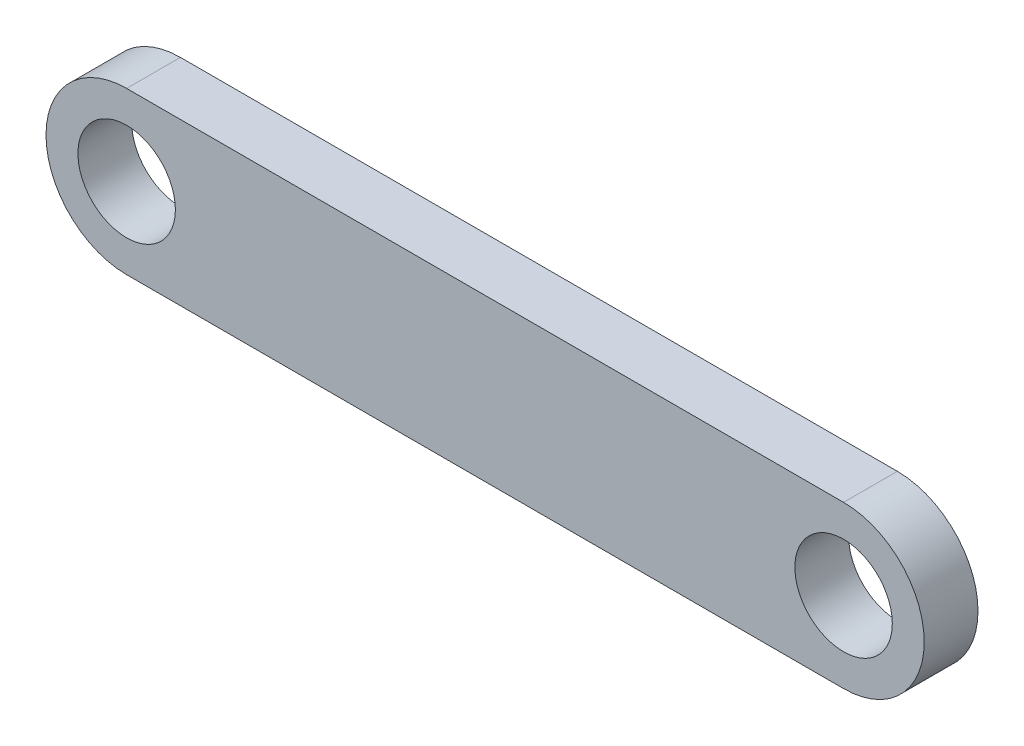
ISO-10303-21;
HEADER;
FILE_DESCRIPTION(('STEP AP214'),'2;1');
FILE_NAME('part.step','',(''),(''),'','','');
FILE_SCHEMA(('AUTOMOTIVE_DESIGN { 1 0 10303 214 1 1 1 1 }'));
ENDSEC;
DATA;
#1=APPLICATION_CONTEXT('core data for automotive mechanical design processes');
#2=APPLICATION_PROTOCOL_DEFINITION('international standard','automotive_design',2000,#1);
#3=PRODUCT_CONTEXT('',#1,'mechanical');
#4=PRODUCT('Part','Part','',(#3));
#5=PRODUCT_RELATED_PRODUCT_CATEGORY('part','',(#4));
#6=PRODUCT_DEFINITION_FORMATION('','',#4);
#7=PRODUCT_DEFINITION_CONTEXT('part definition',#1,'design');
#8=PRODUCT_DEFINITION('design','',#6,#7);
#9=PRODUCT_DEFINITION_SHAPE('','',#8);
#10=(LENGTH_UNIT() NAMED_UNIT(*) SI_UNIT(.MILLI.,.METRE.));
#11=(NAMED_UNIT(*) PLANE_ANGLE_UNIT() SI_UNIT($,.RADIAN.));
#12=(NAMED_UNIT(*) SI_UNIT($,.STERADIAN.) SOLID_ANGLE_UNIT());
#13=UNCERTAINTY_MEASURE_WITH_UNIT(LENGTH_MEASURE(1.E-05),#10,'distance_accuracy_value','');
#14=(GEOMETRIC_REPRESENTATION_CONTEXT(3) GLOBAL_UNCERTAINTY_ASSIGNED_CONTEXT((#13)) GLOBAL_UNIT_ASSIGNED_CONTEXT((#10,
#11,#12)) REPRESENTATION_CONTEXT('',''));
#15=CARTESIAN_POINT('',(0.,0.,0.));
#16=DIRECTION('',(0.,0.,1.));
#17=DIRECTION('',(1.,0.,0.));
#18=AXIS2_PLACEMENT_3D('',#15,#16,#17);
#19=CARTESIAN_POINT('',(0.,0.,5.08));
#20=DIRECTION('',(0.,0.,1.));
#21=DIRECTION('',(1.,0.,0.));
#22=AXIS2_PLACEMENT_3D('',#19,#20,#21);
#23=PLANE('',#22);
#24=CARTESIAN_POINT('',(0.,0.,5.08));
#25=DIRECTION('',(0.,0.,1.));
#26=DIRECTION('',(1.,0.,0.));
#27=AXIS2_PLACEMENT_3D('',#24,#25,#26);
#28=CIRCLE('',#27,4.60375);
#29=CARTESIAN_POINT('',(4.60375,0.,5.08));
#30=VERTEX_POINT('',#29);
#31=EDGE_CURVE('E106',#30,#30,#28,.T.);
#32=ORIENTED_EDGE('',*,*,#31,.F.);
#33=EDGE_LOOP('',(#32));
#34=FACE_BOUND('',#33,.T.);
#35=CARTESIAN_POINT('',(0.,0.,5.08));
#36=DIRECTION('',(0.,0.,1.));
#37=DIRECTION('',(1.,0.,0.));
#38=AXIS2_PLACEMENT_3D('',#35,#36,#37);
#39=CIRCLE('',#38,7.62);
#40=CARTESIAN_POINT('',(0.,7.62,5.08));
#41=VERTEX_POINT('',#40);
#42=CARTESIAN_POINT('',(0.,-7.62,5.08));
#43=VERTEX_POINT('',#42);
#44=EDGE_CURVE('E91',#41,#43,#39,.T.);
#45=ORIENTED_EDGE('',*,*,#44,.T.);
#46=DIRECTION('',(1.,0.,0.));
#47=VECTOR('',#46,1.);
#48=CARTESIAN_POINT('',(0.,-7.62,5.08));
#49=LINE('',#48,#47);
#50=CARTESIAN_POINT('',(67.7333333333333,-7.62,5.08));
#51=VERTEX_POINT('',#50);
#52=EDGE_CURVE('E86',#43,#51,#49,.T.);
#53=ORIENTED_EDGE('',*,*,#52,.T.);
#54=CARTESIAN_POINT('',(67.7333333333333,0.,5.08));
#55=DIRECTION('',(0.,0.,1.));
#56=DIRECTION('',(1.,0.,0.));
#57=AXIS2_PLACEMENT_3D('',#54,#55,#56);
#58=CIRCLE('',#57,7.62);
#59=CARTESIAN_POINT('',(67.7333333333333,7.62,5.08));
#60=VERTEX_POINT('',#59);
#61=EDGE_CURVE('E89',#51,#60,#58,.T.);
#62=ORIENTED_EDGE('',*,*,#61,.T.);
#63=DIRECTION('',(-1.,0.,0.));
#64=VECTOR('',#63,1.);
#65=CARTESIAN_POINT('',(0.,7.62,5.08));
#66=LINE('',#65,#64);
#67=EDGE_CURVE('E56',#60,#41,#66,.T.);
#68=ORIENTED_EDGE('',*,*,#67,.T.);
#69=EDGE_LOOP('',(#45,#53,#62,#68));
#70=FACE_BOUND('',#69,.T.);
#71=CARTESIAN_POINT('',(67.7333333333333,0.,5.08));
#72=DIRECTION('',(0.,0.,1.));
#73=DIRECTION('',(1.,0.,0.));
#74=AXIS2_PLACEMENT_3D('',#71,#72,#73);
#75=CIRCLE('',#74,4.60375000000001);
#76=CARTESIAN_POINT('',(72.3370833333333,0.,5.08));
#77=VERTEX_POINT('',#76);
#78=EDGE_CURVE('E121',#77,#77,#75,.T.);
#79=ORIENTED_EDGE('',*,*,#78,.F.);
#80=EDGE_LOOP('',(#79));
#81=FACE_BOUND('',#80,.T.);
#82=ADVANCED_FACE('F39',(#34,#70,#81),#23,.T.);
#83=CARTESIAN_POINT('',(0.,0.,0.));
#84=DIRECTION('',(0.,0.,1.));
#85=DIRECTION('',(1.,0.,0.));
#86=AXIS2_PLACEMENT_3D('',#83,#84,#85);
#87=PLANE('',#86);
#88=CARTESIAN_POINT('',(0.,0.,0.));
#89=DIRECTION('',(0.,0.,1.));
#90=DIRECTION('',(1.,0.,0.));
#91=AXIS2_PLACEMENT_3D('',#88,#89,#90);
#92=CIRCLE('',#91,7.62);
#93=CARTESIAN_POINT('',(0.,7.62,0.));
#94=VERTEX_POINT('',#93);
#95=CARTESIAN_POINT('',(0.,-7.62,0.));
#96=VERTEX_POINT('',#95);
#97=EDGE_CURVE('E103',#94,#96,#92,.T.);
#98=ORIENTED_EDGE('',*,*,#97,.F.);
#99=DIRECTION('',(-1.,0.,0.));
#100=VECTOR('',#99,1.);
#101=CARTESIAN_POINT('',(0.,7.62,0.));
#102=LINE('',#101,#100);
#103=CARTESIAN_POINT('',(67.7333333333333,7.62,0.));
#104=VERTEX_POINT('',#103);
#105=EDGE_CURVE('E79',#104,#94,#102,.T.);
#106=ORIENTED_EDGE('',*,*,#105,.F.);
#107=CARTESIAN_POINT('',(67.7333333333333,0.,0.));
#108=DIRECTION('',(0.,0.,1.));
#109=DIRECTION('',(1.,0.,0.));
#110=AXIS2_PLACEMENT_3D('',#107,#108,#109);
#111=CIRCLE('',#110,7.62);
#112=CARTESIAN_POINT('',(67.7333333333333,-7.62,0.));
#113=VERTEX_POINT('',#112);
#114=EDGE_CURVE('E73',#113,#104,#111,.T.);
#115=ORIENTED_EDGE('',*,*,#114,.F.);
#116=DIRECTION('',(1.,0.,0.));
#117=VECTOR('',#116,1.);
#118=CARTESIAN_POINT('',(0.,-7.62,0.));
#119=LINE('',#118,#117);
#120=EDGE_CURVE('E95',#96,#113,#119,.T.);
#121=ORIENTED_EDGE('',*,*,#120,.F.);
#122=EDGE_LOOP('',(#98,#106,#115,#121));
#123=FACE_BOUND('',#122,.T.);
#124=CARTESIAN_POINT('',(0.,0.,0.));
#125=DIRECTION('',(0.,0.,1.));
#126=DIRECTION('',(1.,0.,0.));
#127=AXIS2_PLACEMENT_3D('',#124,#125,#126);
#128=CIRCLE('',#127,4.60375);
#129=CARTESIAN_POINT('',(4.60375,0.,0.));
#130=VERTEX_POINT('',#129);
#131=EDGE_CURVE('E118',#130,#130,#128,.T.);
#132=ORIENTED_EDGE('',*,*,#131,.T.);
#133=EDGE_LOOP('',(#132));
#134=FACE_BOUND('',#133,.T.);
#135=CARTESIAN_POINT('',(67.7333333333333,0.,0.));
#136=DIRECTION('',(0.,0.,1.));
#137=DIRECTION('',(1.,0.,0.));
#138=AXIS2_PLACEMENT_3D('',#135,#136,#137);
#139=CIRCLE('',#138,4.60375000000001);
#140=CARTESIAN_POINT('',(72.3370833333333,0.,0.));
#141=VERTEX_POINT('',#140);
#142=EDGE_CURVE('E124',#141,#141,#139,.T.);
#143=ORIENTED_EDGE('',*,*,#142,.T.);
#144=EDGE_LOOP('',(#143));
#145=FACE_BOUND('',#144,.T.);
#146=ADVANCED_FACE('F114',(#123,#134,#145),#87,.F.);
#147=CARTESIAN_POINT('',(0.,0.,5.08));
#148=DIRECTION('',(0.,0.,-1.));
#149=DIRECTION('',(-1.,0.,0.));
#150=AXIS2_PLACEMENT_3D('',#147,#148,#149);
#151=CYLINDRICAL_SURFACE('',#150,7.62);
#152=ORIENTED_EDGE('',*,*,#97,.T.);
#153=DIRECTION('',(0.,0.,-1.));
#154=VECTOR('',#153,1.);
#155=CARTESIAN_POINT('',(0.,-7.62,5.08));
#156=LINE('',#155,#154);
#157=EDGE_CURVE('E11',#43,#96,#156,.T.);
#158=ORIENTED_EDGE('',*,*,#157,.F.);
#159=ORIENTED_EDGE('',*,*,#44,.F.);
#160=DIRECTION('',(0.,0.,-1.));
#161=VECTOR('',#160,1.);
#162=CARTESIAN_POINT('',(0.,7.62,5.08));
#163=LINE('',#162,#161);
#164=EDGE_CURVE('E99',#41,#94,#163,.T.);
#165=ORIENTED_EDGE('',*,*,#164,.T.);
#166=EDGE_LOOP('',(#152,#158,#159,#165));
#167=FACE_BOUND('',#166,.T.);
#168=ADVANCED_FACE('F41',(#167),#151,.T.);
#169=CARTESIAN_POINT('',(0.,-7.62,5.08));
#170=DIRECTION('',(0.,1.,0.));
#171=DIRECTION('',(0.,0.,1.));
#172=AXIS2_PLACEMENT_3D('',#169,#170,#171);
#173=PLANE('',#172);
#174=ORIENTED_EDGE('',*,*,#120,.T.);
#175=DIRECTION('',(0.,0.,-1.));
#176=VECTOR('',#175,1.);
#177=CARTESIAN_POINT('',(67.7333333333333,-7.62,5.08));
#178=LINE('',#177,#176);
#179=EDGE_CURVE('E48',#51,#113,#178,.T.);
#180=ORIENTED_EDGE('',*,*,#179,.F.);
#181=ORIENTED_EDGE('',*,*,#52,.F.);
#182=ORIENTED_EDGE('',*,*,#157,.T.);
#183=EDGE_LOOP('',(#174,#180,#181,#182));
#184=FACE_BOUND('',#183,.T.);
#185=ADVANCED_FACE('F94',(#184),#173,.F.);
#186=CARTESIAN_POINT('',(67.7333333333333,0.,5.08));
#187=DIRECTION('',(0.,0.,-1.));
#188=DIRECTION('',(-1.,0.,0.));
#189=AXIS2_PLACEMENT_3D('',#186,#187,#188);
#190=CYLINDRICAL_SURFACE('',#189,7.62);
#191=ORIENTED_EDGE('',*,*,#114,.T.);
#192=DIRECTION('',(0.,0.,-1.));
#193=VECTOR('',#192,1.);
#194=CARTESIAN_POINT('',(67.7333333333333,7.62,5.08));
#195=LINE('',#194,#193);
#196=EDGE_CURVE('E96',#60,#104,#195,.T.);
#197=ORIENTED_EDGE('',*,*,#196,.F.);
#198=ORIENTED_EDGE('',*,*,#61,.F.);
#199=ORIENTED_EDGE('',*,*,#179,.T.);
#200=EDGE_LOOP('',(#191,#197,#198,#199));
#201=FACE_BOUND('',#200,.T.);
#202=ADVANCED_FACE('F97',(#201),#190,.T.);
#203=CARTESIAN_POINT('',(0.,7.62,5.08));
#204=DIRECTION('',(0.,-1.,0.));
#205=DIRECTION('',(0.,0.,-1.));
#206=AXIS2_PLACEMENT_3D('',#203,#204,#205);
#207=PLANE('',#206);
#208=ORIENTED_EDGE('',*,*,#105,.T.);
#209=ORIENTED_EDGE('',*,*,#164,.F.);
#210=ORIENTED_EDGE('',*,*,#67,.F.);
#211=ORIENTED_EDGE('',*,*,#196,.T.);
#212=EDGE_LOOP('',(#208,#209,#210,#211));
#213=FACE_BOUND('',#212,.T.);
#214=ADVANCED_FACE('F111',(#213),#207,.F.);
#215=CARTESIAN_POINT('',(0.,0.,5.08));
#216=DIRECTION('',(0.,0.,-1.));
#217=DIRECTION('',(-1.,0.,0.));
#218=AXIS2_PLACEMENT_3D('',#215,#216,#217);
#219=CYLINDRICAL_SURFACE('',#218,4.60375);
#220=ORIENTED_EDGE('',*,*,#31,.T.);
#221=EDGE_LOOP('',(#220));
#222=FACE_BOUND('',#221,.T.);
#223=ORIENTED_EDGE('',*,*,#131,.F.);
#224=EDGE_LOOP('',(#223));
#225=FACE_BOUND('',#224,.T.);
#226=ADVANCED_FACE('F141',(#222,#225),#219,.F.);
#227=CARTESIAN_POINT('',(67.7333333333333,0.,5.08));
#228=DIRECTION('',(0.,0.,-1.));
#229=DIRECTION('',(-1.,0.,0.));
#230=AXIS2_PLACEMENT_3D('',#227,#228,#229);
#231=CYLINDRICAL_SURFACE('',#230,4.60375000000001);
#232=ORIENTED_EDGE('',*,*,#78,.T.);
#233=EDGE_LOOP('',(#232));
#234=FACE_BOUND('',#233,.T.);
#235=ORIENTED_EDGE('',*,*,#142,.F.);
#236=EDGE_LOOP('',(#235));
#237=FACE_BOUND('',#236,.T.);
#238=ADVANCED_FACE('F130',(#234,#237),#231,.F.);
#239=CLOSED_SHELL('',(#82,#146,#168,#185,#202,#214,#226,#238));
#240=MANIFOLD_SOLID_BREP('B2',#239);
#241=ADVANCED_BREP_SHAPE_REPRESENTATION('',(#18,#240),#14);
#242=SHAPE_DEFINITION_REPRESENTATION(#9,#241);
ENDSEC;
END-ISO-10303-21;
